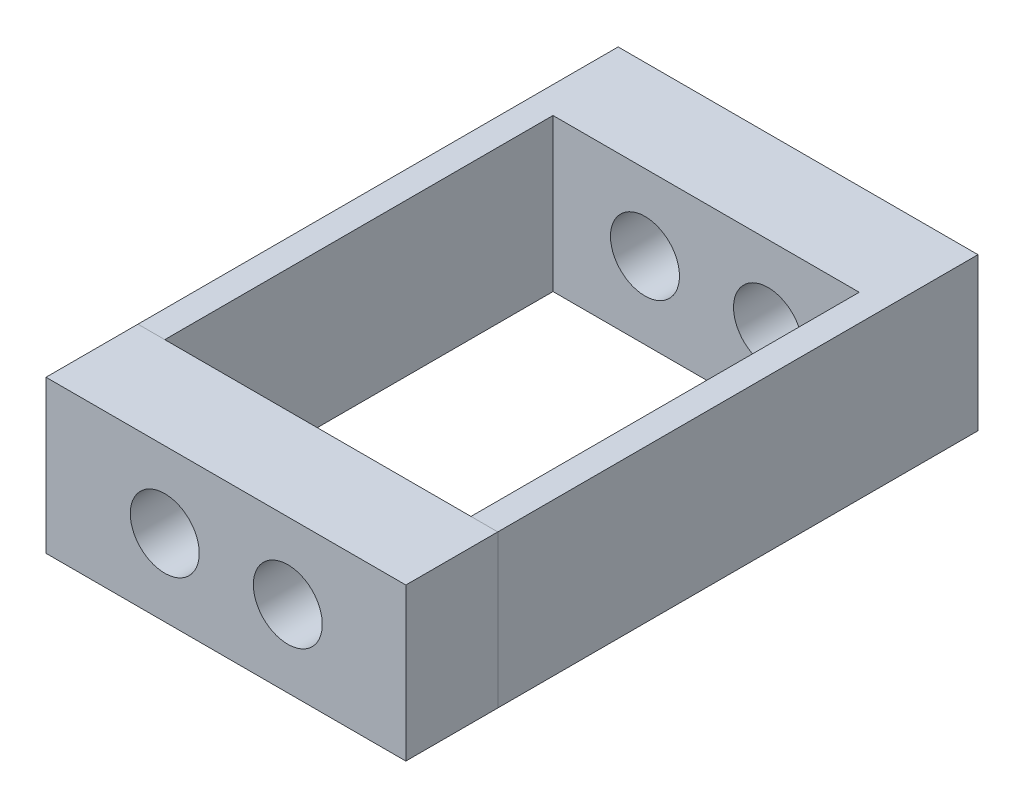
ISO-10303-21;
HEADER;
FILE_DESCRIPTION(('STEP AP214'),'2;1');
FILE_NAME('part.step','',(''),(''),'','','');
FILE_SCHEMA(('AUTOMOTIVE_DESIGN { 1 0 10303 214 1 1 1 1 }'));
ENDSEC;
DATA;
#1=APPLICATION_CONTEXT('core data for automotive mechanical design processes');
#2=APPLICATION_PROTOCOL_DEFINITION('international standard','automotive_design',2000,#1);
#3=PRODUCT_CONTEXT('',#1,'mechanical');
#4=PRODUCT('Part','Part','',(#3));
#5=PRODUCT_RELATED_PRODUCT_CATEGORY('part','',(#4));
#6=PRODUCT_DEFINITION_FORMATION('','',#4);
#7=PRODUCT_DEFINITION_CONTEXT('part definition',#1,'design');
#8=PRODUCT_DEFINITION('design','',#6,#7);
#9=PRODUCT_DEFINITION_SHAPE('','',#8);
#10=(LENGTH_UNIT() NAMED_UNIT(*) SI_UNIT(.MILLI.,.METRE.));
#11=(NAMED_UNIT(*) PLANE_ANGLE_UNIT() SI_UNIT($,.RADIAN.));
#12=(NAMED_UNIT(*) SI_UNIT($,.STERADIAN.) SOLID_ANGLE_UNIT());
#13=UNCERTAINTY_MEASURE_WITH_UNIT(LENGTH_MEASURE(1.E-05),#10,'distance_accuracy_value','');
#14=(GEOMETRIC_REPRESENTATION_CONTEXT(3) GLOBAL_UNCERTAINTY_ASSIGNED_CONTEXT((#13)) GLOBAL_UNIT_ASSIGNED_CONTEXT((#10,
#11,#12)) REPRESENTATION_CONTEXT('',''));
#15=CARTESIAN_POINT('',(0.,0.,0.));
#16=DIRECTION('',(0.,0.,1.));
#17=DIRECTION('',(1.,0.,0.));
#18=AXIS2_PLACEMENT_3D('',#15,#16,#17);
#19=CARTESIAN_POINT('',(0.,0.,259.765800000025));
#20=DIRECTION('',(0.,0.,-1.));
#21=DIRECTION('',(-1.,0.,0.));
#22=AXIS2_PLACEMENT_3D('',#19,#20,#21);
#23=PLANE('',#22);
#24=DIRECTION('',(0.,1.,0.));
#25=VECTOR('',#24,1.);
#26=CARTESIAN_POINT('',(99.8991867373547,311.52283430118,259.765800000025));
#27=LINE('',#26,#25);
#28=CARTESIAN_POINT('',(99.8991867373547,-31.75,259.765800000025));
#29=VERTEX_POINT('',#28);
#30=CARTESIAN_POINT('',(99.8991867373547,31.4461867373069,259.765800000025));
#31=VERTEX_POINT('',#30);
#32=EDGE_CURVE('E128',#29,#31,#27,.T.);
#33=ORIENTED_EDGE('',*,*,#32,.F.);
#34=DIRECTION('',(1.,0.,0.));
#35=VECTOR('',#34,1.);
#36=CARTESIAN_POINT('',(-399999.0602,-31.75,259.765800000025));
#37=LINE('',#36,#35);
#38=CARTESIAN_POINT('',(-49.2124999999874,-31.75,259.765800000025));
#39=VERTEX_POINT('',#38);
#40=EDGE_CURVE('E119',#39,#29,#37,.T.);
#41=ORIENTED_EDGE('',*,*,#40,.F.);
#42=DIRECTION('',(0.,1.,0.));
#43=VECTOR('',#42,1.);
#44=CARTESIAN_POINT('',(-49.2124999999874,311.52283430118,259.765800000025));
#45=LINE('',#44,#43);
#46=CARTESIAN_POINT('',(-49.2124999999874,31.4461867373069,259.765800000025));
#47=VERTEX_POINT('',#46);
#48=EDGE_CURVE('E136',#39,#47,#45,.T.);
#49=ORIENTED_EDGE('',*,*,#48,.T.);
#50=DIRECTION('',(1.,0.,0.));
#51=VECTOR('',#50,1.);
#52=CARTESIAN_POINT('',(-399999.0602,31.4461867373069,259.765800000025));
#53=LINE('',#52,#51);
#54=EDGE_CURVE('E134',#47,#31,#53,.T.);
#55=ORIENTED_EDGE('',*,*,#54,.T.);
#56=EDGE_LOOP('',(#33,#41,#49,#55));
#57=FACE_BOUND('',#56,.T.);
#58=CARTESIAN_POINT('',(0.,0.,259.765800000025));
#59=DIRECTION('',(0.,0.,-1.));
#60=DIRECTION('',(-1.,0.,0.));
#61=AXIS2_PLACEMENT_3D('',#58,#59,#60);
#62=CIRCLE('',#61,14.2875);
#63=CARTESIAN_POINT('',(-14.2875,0.,259.765800000025));
#64=VERTEX_POINT('',#63);
#65=EDGE_CURVE('E155',#64,#64,#62,.T.);
#66=ORIENTED_EDGE('',*,*,#65,.F.);
#67=EDGE_LOOP('',(#66));
#68=FACE_BOUND('',#67,.T.);
#69=CARTESIAN_POINT('',(50.9905,0.,259.765800000025));
#70=DIRECTION('',(0.,0.,-1.));
#71=DIRECTION('',(-1.,0.,0.));
#72=AXIS2_PLACEMENT_3D('',#69,#70,#71);
#73=CIRCLE('',#72,14.2875);
#74=CARTESIAN_POINT('',(36.703,0.,259.765800000025));
#75=VERTEX_POINT('',#74);
#76=EDGE_CURVE('E14',#75,#75,#73,.T.);
#77=ORIENTED_EDGE('',*,*,#76,.F.);
#78=EDGE_LOOP('',(#77));
#79=FACE_BOUND('',#78,.T.);
#80=ADVANCED_FACE('F76',(#57,#68,#79),#23,.T.);
#81=CARTESIAN_POINT('',(-399999.0602,311.52283430118,297.865800000011));
#82=DIRECTION('',(0.,0.,-1.));
#83=DIRECTION('',(-1.,0.,0.));
#84=AXIS2_PLACEMENT_3D('',#81,#82,#83);
#85=PLANE('',#84);
#86=CARTESIAN_POINT('',(0.,0.,297.865800000011));
#87=DIRECTION('',(0.,0.,-1.));
#88=DIRECTION('',(-1.,0.,0.));
#89=AXIS2_PLACEMENT_3D('',#86,#87,#88);
#90=CIRCLE('',#89,14.2875);
#91=CARTESIAN_POINT('',(-14.2875,0.,297.865800000011));
#92=VERTEX_POINT('',#91);
#93=EDGE_CURVE('E151',#92,#92,#90,.T.);
#94=ORIENTED_EDGE('',*,*,#93,.T.);
#95=EDGE_LOOP('',(#94));
#96=FACE_BOUND('',#95,.T.);
#97=CARTESIAN_POINT('',(50.9905,0.,297.865800000011));
#98=DIRECTION('',(0.,0.,-1.));
#99=DIRECTION('',(-1.,0.,0.));
#100=AXIS2_PLACEMENT_3D('',#97,#98,#99);
#101=CIRCLE('',#100,14.2875);
#102=CARTESIAN_POINT('',(36.703,0.,297.865800000011));
#103=VERTEX_POINT('',#102);
#104=EDGE_CURVE('E85',#103,#103,#101,.T.);
#105=ORIENTED_EDGE('',*,*,#104,.T.);
#106=EDGE_LOOP('',(#105));
#107=FACE_BOUND('',#106,.T.);
#108=DIRECTION('',(1.,0.,0.));
#109=VECTOR('',#108,1.);
#110=CARTESIAN_POINT('',(-399999.0602,31.4461867373069,297.865800000011));
#111=LINE('',#110,#109);
#112=CARTESIAN_POINT('',(-49.2125000000101,31.4461867373069,297.865800000011));
#113=VERTEX_POINT('',#112);
#114=CARTESIAN_POINT('',(99.899186737332,31.4461867373069,297.865800000011));
#115=VERTEX_POINT('',#114);
#116=EDGE_CURVE('E144',#113,#115,#111,.T.);
#117=ORIENTED_EDGE('',*,*,#116,.F.);
#118=DIRECTION('',(0.,-1.,0.));
#119=VECTOR('',#118,1.);
#120=CARTESIAN_POINT('',(-49.2125000000101,311.52283430118,297.865800000011));
#121=LINE('',#120,#119);
#122=CARTESIAN_POINT('',(-49.2125000000101,-31.75,297.865800000011));
#123=VERTEX_POINT('',#122);
#124=EDGE_CURVE('E135',#113,#123,#121,.T.);
#125=ORIENTED_EDGE('',*,*,#124,.T.);
#126=DIRECTION('',(1.,0.,0.));
#127=VECTOR('',#126,1.);
#128=CARTESIAN_POINT('',(-399999.0602,-31.75,297.865800000011));
#129=LINE('',#128,#127);
#130=CARTESIAN_POINT('',(99.899186737332,-31.75,297.865800000011));
#131=VERTEX_POINT('',#130);
#132=EDGE_CURVE('E131',#123,#131,#129,.T.);
#133=ORIENTED_EDGE('',*,*,#132,.T.);
#134=DIRECTION('',(0.,-1.,0.));
#135=VECTOR('',#134,1.);
#136=CARTESIAN_POINT('',(99.899186737332,311.52283430118,297.865800000011));
#137=LINE('',#136,#135);
#138=EDGE_CURVE('E129',#115,#131,#137,.T.);
#139=ORIENTED_EDGE('',*,*,#138,.F.);
#140=EDGE_LOOP('',(#117,#125,#133,#139));
#141=FACE_BOUND('',#140,.T.);
#142=ADVANCED_FACE('F165',(#96,#107,#141),#85,.F.);
#143=CARTESIAN_POINT('',(0.,0.,60.7822000000056));
#144=DIRECTION('',(0.,0.,1.));
#145=DIRECTION('',(1.,0.,0.));
#146=AXIS2_PLACEMENT_3D('',#143,#144,#145);
#147=CYLINDRICAL_SURFACE('',#146,14.2875);
#148=ORIENTED_EDGE('',*,*,#65,.T.);
#149=EDGE_LOOP('',(#148));
#150=FACE_BOUND('',#149,.T.);
#151=ORIENTED_EDGE('',*,*,#93,.F.);
#152=EDGE_LOOP('',(#151));
#153=FACE_BOUND('',#152,.T.);
#154=ADVANCED_FACE('F78',(#150,#153),#147,.F.);
#155=CARTESIAN_POINT('',(50.9905,0.,60.7822000000056));
#156=DIRECTION('',(0.,0.,1.));
#157=DIRECTION('',(1.,0.,0.));
#158=AXIS2_PLACEMENT_3D('',#155,#156,#157);
#159=CYLINDRICAL_SURFACE('',#158,14.2875);
#160=ORIENTED_EDGE('',*,*,#76,.T.);
#161=EDGE_LOOP('',(#160));
#162=FACE_BOUND('',#161,.T.);
#163=ORIENTED_EDGE('',*,*,#104,.F.);
#164=EDGE_LOOP('',(#163));
#165=FACE_BOUND('',#164,.T.);
#166=ADVANCED_FACE('F169',(#162,#165),#159,.F.);
#167=CARTESIAN_POINT('',(-49.2124999999533,311.52283430118,291851.44222));
#168=DIRECTION('',(1.,0.,0.));
#169=DIRECTION('',(0.,0.,-1.));
#170=AXIS2_PLACEMENT_3D('',#167,#168,#169);
#171=PLANE('',#170);
#172=ORIENTED_EDGE('',*,*,#48,.F.);
#173=DIRECTION('',(0.,0.,1.));
#174=VECTOR('',#173,1.);
#175=CARTESIAN_POINT('',(-49.2124999999533,-31.75,291851.44222));
#176=LINE('',#175,#174);
#177=EDGE_CURVE('E121',#39,#123,#176,.T.);
#178=ORIENTED_EDGE('',*,*,#177,.T.);
#179=ORIENTED_EDGE('',*,*,#124,.F.);
#180=DIRECTION('',(0.,0.,1.));
#181=VECTOR('',#180,1.);
#182=CARTESIAN_POINT('',(-49.2124999999533,31.4461867373069,291851.44222));
#183=LINE('',#182,#181);
#184=EDGE_CURVE('E80',#47,#113,#183,.T.);
#185=ORIENTED_EDGE('',*,*,#184,.F.);
#186=EDGE_LOOP('',(#172,#178,#179,#185));
#187=FACE_BOUND('',#186,.T.);
#188=ADVANCED_FACE('F167',(#187),#171,.F.);
#189=CARTESIAN_POINT('',(99.8991867373888,311.52283430118,291851.44222));
#190=DIRECTION('',(1.,0.,0.));
#191=DIRECTION('',(0.,0.,-1.));
#192=AXIS2_PLACEMENT_3D('',#189,#190,#191);
#193=PLANE('',#192);
#194=DIRECTION('',(0.,0.,1.));
#195=VECTOR('',#194,1.);
#196=CARTESIAN_POINT('',(99.8991867373888,-31.75,291851.44222));
#197=LINE('',#196,#195);
#198=EDGE_CURVE('E101',#29,#131,#197,.T.);
#199=ORIENTED_EDGE('',*,*,#198,.F.);
#200=ORIENTED_EDGE('',*,*,#32,.T.);
#201=DIRECTION('',(0.,0.,1.));
#202=VECTOR('',#201,1.);
#203=CARTESIAN_POINT('',(99.8991867373888,31.4461867373069,291851.44222));
#204=LINE('',#203,#202);
#205=EDGE_CURVE('E93',#31,#115,#204,.T.);
#206=ORIENTED_EDGE('',*,*,#205,.T.);
#207=ORIENTED_EDGE('',*,*,#138,.T.);
#208=EDGE_LOOP('',(#199,#200,#206,#207));
#209=FACE_BOUND('',#208,.T.);
#210=ADVANCED_FACE('F127',(#209),#193,.T.);
#211=CARTESIAN_POINT('',(0.,31.4461867373068,0.));
#212=DIRECTION('',(0.,1.,0.));
#213=DIRECTION('',(0.,0.,1.));
#214=AXIS2_PLACEMENT_3D('',#211,#212,#213);
#215=PLANE('',#214);
#216=ORIENTED_EDGE('',*,*,#205,.F.);
#217=ORIENTED_EDGE('',*,*,#54,.F.);
#218=ORIENTED_EDGE('',*,*,#184,.T.);
#219=ORIENTED_EDGE('',*,*,#116,.T.);
#220=EDGE_LOOP('',(#216,#217,#218,#219));
#221=FACE_BOUND('',#220,.T.);
#222=ADVANCED_FACE('F174',(#221),#215,.T.);
#223=CARTESIAN_POINT('',(0.,-31.75,0.));
#224=DIRECTION('',(0.,1.,0.));
#225=DIRECTION('',(0.,0.,1.));
#226=AXIS2_PLACEMENT_3D('',#223,#224,#225);
#227=PLANE('',#226);
#228=ORIENTED_EDGE('',*,*,#40,.T.);
#229=ORIENTED_EDGE('',*,*,#198,.T.);
#230=ORIENTED_EDGE('',*,*,#132,.F.);
#231=ORIENTED_EDGE('',*,*,#177,.F.);
#232=EDGE_LOOP('',(#228,#229,#230,#231));
#233=FACE_BOUND('',#232,.T.);
#234=ADVANCED_FACE('F120',(#233),#227,.F.);
#235=CLOSED_SHELL('',(#80,#142,#154,#166,#188,#210,#222,#234));
#236=MANIFOLD_SOLID_BREP('B2',#235);
#237=CARTESIAN_POINT('',(0.,0.,259.765800000025));
#238=DIRECTION('',(0.,0.,-1.));
#239=DIRECTION('',(-1.,0.,0.));
#240=AXIS2_PLACEMENT_3D('',#237,#238,#239);
#241=PLANE('',#240);
#242=DIRECTION('',(0.,-1.,0.));
#243=VECTOR('',#242,1.);
#244=CARTESIAN_POINT('',(88.7866867373143,311.52283430118,259.765800000025));
#245=LINE('',#244,#243);
#246=CARTESIAN_POINT('',(88.7866867373143,31.4461867373069,259.765800000025));
#247=VERTEX_POINT('',#246);
#248=CARTESIAN_POINT('',(88.7866867373143,-31.75,259.765800000025));
#249=VERTEX_POINT('',#248);
#250=EDGE_CURVE('E74',#247,#249,#245,.T.);
#251=ORIENTED_EDGE('',*,*,#250,.T.);
#252=DIRECTION('',(-1.,0.,0.));
#253=VECTOR('',#252,1.);
#254=CARTESIAN_POINT('',(0.,-31.75,259.765800000025));
#255=LINE('',#254,#253);
#256=CARTESIAN_POINT('',(99.8991867373547,-31.75,259.765800000025));
#257=VERTEX_POINT('',#256);
#258=EDGE_CURVE('E252',#257,#249,#255,.T.);
#259=ORIENTED_EDGE('',*,*,#258,.F.);
#260=DIRECTION('',(0.,1.,0.));
#261=VECTOR('',#260,1.);
#262=CARTESIAN_POINT('',(99.8991867373547,311.52283430118,259.765800000025));
#263=LINE('',#262,#261);
#264=CARTESIAN_POINT('',(99.8991867373547,31.4461867373069,259.765800000025));
#265=VERTEX_POINT('',#264);
#266=EDGE_CURVE('E360',#257,#265,#263,.T.);
#267=ORIENTED_EDGE('',*,*,#266,.T.);
#268=DIRECTION('',(-1.,0.,0.));
#269=VECTOR('',#268,1.);
#270=CARTESIAN_POINT('',(0.,31.4461867373068,259.765800000025));
#271=LINE('',#270,#269);
#272=EDGE_CURVE('E264',#265,#247,#271,.T.);
#273=ORIENTED_EDGE('',*,*,#272,.T.);
#274=EDGE_LOOP('',(#251,#259,#267,#273));
#275=FACE_BOUND('',#274,.T.);
#276=ADVANCED_FACE('F248',(#275),#241,.F.);
#277=CARTESIAN_POINT('',(-38.0999999999667,31.4461867373069,259.765800000025));
#278=VERTEX_POINT('',#277);
#279=CARTESIAN_POINT('',(-49.2124999999874,31.4461867373069,259.765800000025));
#280=VERTEX_POINT('',#279);
#281=EDGE_CURVE('E257',#278,#280,#271,.T.);
#282=ORIENTED_EDGE('',*,*,#281,.T.);
#283=DIRECTION('',(0.,1.,0.));
#284=VECTOR('',#283,1.);
#285=CARTESIAN_POINT('',(-49.2124999999874,311.52283430118,259.765800000025));
#286=LINE('',#285,#284);
#287=CARTESIAN_POINT('',(-49.2124999999874,-31.75,259.765800000025));
#288=VERTEX_POINT('',#287);
#289=EDGE_CURVE('E361',#288,#280,#286,.T.);
#290=ORIENTED_EDGE('',*,*,#289,.F.);
#291=CARTESIAN_POINT('',(-38.0999999999667,-31.75,259.765800000025));
#292=VERTEX_POINT('',#291);
#293=EDGE_CURVE('E325',#292,#288,#255,.T.);
#294=ORIENTED_EDGE('',*,*,#293,.F.);
#295=DIRECTION('',(0.,-1.,0.));
#296=VECTOR('',#295,1.);
#297=CARTESIAN_POINT('',(-38.0999999999667,311.52283430118,259.765800000025));
#298=LINE('',#297,#296);
#299=EDGE_CURVE('E342',#278,#292,#298,.T.);
#300=ORIENTED_EDGE('',*,*,#299,.F.);
#301=EDGE_LOOP('',(#282,#290,#294,#300));
#302=FACE_BOUND('',#301,.T.);
#303=ADVANCED_FACE('F250',(#302),#241,.F.);
#304=CARTESIAN_POINT('',(-49.2124999999533,311.52283430118,291851.44222));
#305=DIRECTION('',(1.,0.,0.));
#306=DIRECTION('',(0.,0.,-1.));
#307=AXIS2_PLACEMENT_3D('',#304,#305,#306);
#308=PLANE('',#307);
#309=DIRECTION('',(0.,0.,1.));
#310=VECTOR('',#309,1.);
#311=CARTESIAN_POINT('',(-49.2124999999533,-31.75,291851.44222));
#312=LINE('',#311,#310);
#313=CARTESIAN_POINT('',(-49.2124999999874,-31.75,60.7822000000056));
#314=VERTEX_POINT('',#313);
#315=EDGE_CURVE('E350',#314,#288,#312,.T.);
#316=ORIENTED_EDGE('',*,*,#315,.T.);
#317=ORIENTED_EDGE('',*,*,#289,.T.);
#318=DIRECTION('',(0.,0.,1.));
#319=VECTOR('',#318,1.);
#320=CARTESIAN_POINT('',(-49.2124999999533,31.4461867373069,291851.44222));
#321=LINE('',#320,#319);
#322=CARTESIAN_POINT('',(-49.2124999999874,31.4461867373069,60.7822000000056));
#323=VERTEX_POINT('',#322);
#324=EDGE_CURVE('E371',#323,#280,#321,.T.);
#325=ORIENTED_EDGE('',*,*,#324,.F.);
#326=DIRECTION('',(0.,-1.,0.));
#327=VECTOR('',#326,1.);
#328=CARTESIAN_POINT('',(-49.2124999999874,311.52283430118,60.7822000000056));
#329=LINE('',#328,#327);
#330=EDGE_CURVE('E356',#323,#314,#329,.T.);
#331=ORIENTED_EDGE('',*,*,#330,.T.);
#332=EDGE_LOOP('',(#316,#317,#325,#331));
#333=FACE_BOUND('',#332,.T.);
#334=ADVANCED_FACE('F369',(#333),#308,.F.);
#335=CARTESIAN_POINT('',(-399999.0602,311.52283430118,60.7822000000056));
#336=DIRECTION('',(0.,0.,-1.));
#337=DIRECTION('',(-1.,0.,0.));
#338=AXIS2_PLACEMENT_3D('',#335,#336,#337);
#339=PLANE('',#338);
#340=CARTESIAN_POINT('',(0.,0.,60.7822000000056));
#341=DIRECTION('',(0.,0.,1.));
#342=DIRECTION('',(1.,0.,0.));
#343=AXIS2_PLACEMENT_3D('',#340,#341,#342);
#344=CIRCLE('',#343,14.2875);
#345=CARTESIAN_POINT('',(14.2875,0.,60.7822000000056));
#346=VERTEX_POINT('',#345);
#347=EDGE_CURVE('E397',#346,#346,#344,.T.);
#348=ORIENTED_EDGE('',*,*,#347,.T.);
#349=EDGE_LOOP('',(#348));
#350=FACE_BOUND('',#349,.T.);
#351=CARTESIAN_POINT('',(50.9905,0.,60.7822000000056));
#352=DIRECTION('',(0.,0.,1.));
#353=DIRECTION('',(1.,0.,0.));
#354=AXIS2_PLACEMENT_3D('',#351,#352,#353);
#355=CIRCLE('',#354,14.2875);
#356=CARTESIAN_POINT('',(65.278,0.,60.7822000000056));
#357=VERTEX_POINT('',#356);
#358=EDGE_CURVE('E398',#357,#357,#355,.T.);
#359=ORIENTED_EDGE('',*,*,#358,.T.);
#360=EDGE_LOOP('',(#359));
#361=FACE_BOUND('',#360,.T.);
#362=ORIENTED_EDGE('',*,*,#330,.F.);
#363=DIRECTION('',(1.,0.,0.));
#364=VECTOR('',#363,1.);
#365=CARTESIAN_POINT('',(-399999.0602,31.4461867373069,60.7822000000056));
#366=LINE('',#365,#364);
#367=CARTESIAN_POINT('',(99.899186737332,31.4461867373069,60.7822000000056));
#368=VERTEX_POINT('',#367);
#369=EDGE_CURVE('E375',#323,#368,#366,.T.);
#370=ORIENTED_EDGE('',*,*,#369,.T.);
#371=DIRECTION('',(0.,-1.,0.));
#372=VECTOR('',#371,1.);
#373=CARTESIAN_POINT('',(99.899186737332,311.52283430118,60.7822000000056));
#374=LINE('',#373,#372);
#375=CARTESIAN_POINT('',(99.899186737332,-31.75,60.7822000000056));
#376=VERTEX_POINT('',#375);
#377=EDGE_CURVE('E326',#368,#376,#374,.T.);
#378=ORIENTED_EDGE('',*,*,#377,.T.);
#379=DIRECTION('',(1.,0.,0.));
#380=VECTOR('',#379,1.);
#381=CARTESIAN_POINT('',(-399999.0602,-31.75,60.7822000000056));
#382=LINE('',#381,#380);
#383=EDGE_CURVE('E353',#314,#376,#382,.T.);
#384=ORIENTED_EDGE('',*,*,#383,.F.);
#385=EDGE_LOOP('',(#362,#370,#378,#384));
#386=FACE_BOUND('',#385,.T.);
#387=ADVANCED_FACE('F374',(#350,#361,#386),#339,.T.);
#388=CARTESIAN_POINT('',(99.8991867373888,311.52283430118,291851.44222));
#389=DIRECTION('',(1.,0.,0.));
#390=DIRECTION('',(0.,0.,-1.));
#391=AXIS2_PLACEMENT_3D('',#388,#389,#390);
#392=PLANE('',#391);
#393=ORIENTED_EDGE('',*,*,#266,.F.);
#394=DIRECTION('',(0.,0.,1.));
#395=VECTOR('',#394,1.);
#396=CARTESIAN_POINT('',(99.8991867373888,-31.75,291851.44222));
#397=LINE('',#396,#395);
#398=EDGE_CURVE('E344',#376,#257,#397,.T.);
#399=ORIENTED_EDGE('',*,*,#398,.F.);
#400=ORIENTED_EDGE('',*,*,#377,.F.);
#401=DIRECTION('',(0.,0.,1.));
#402=VECTOR('',#401,1.);
#403=CARTESIAN_POINT('',(99.8991867373888,31.4461867373069,291851.44222));
#404=LINE('',#403,#402);
#405=EDGE_CURVE('E379',#368,#265,#404,.T.);
#406=ORIENTED_EDGE('',*,*,#405,.T.);
#407=EDGE_LOOP('',(#393,#399,#400,#406));
#408=FACE_BOUND('',#407,.T.);
#409=ADVANCED_FACE('F433',(#408),#392,.T.);
#410=CARTESIAN_POINT('',(0.,-31.75,0.));
#411=DIRECTION('',(0.,1.,0.));
#412=DIRECTION('',(0.,0.,1.));
#413=AXIS2_PLACEMENT_3D('',#410,#411,#412);
#414=PLANE('',#413);
#415=ORIENTED_EDGE('',*,*,#398,.T.);
#416=ORIENTED_EDGE('',*,*,#258,.T.);
#417=DIRECTION('',(0.,0.,1.));
#418=VECTOR('',#417,1.);
#419=CARTESIAN_POINT('',(88.7866867373646,-31.75,291851.44222));
#420=LINE('',#419,#418);
#421=CARTESIAN_POINT('',(88.7866867373077,-31.75,98.8821999999914));
#422=VERTEX_POINT('',#421);
#423=EDGE_CURVE('E381',#422,#249,#420,.T.);
#424=ORIENTED_EDGE('',*,*,#423,.F.);
#425=DIRECTION('',(1.,0.,0.));
#426=VECTOR('',#425,1.);
#427=CARTESIAN_POINT('',(-399999.0602,-31.75,98.8821999999914));
#428=LINE('',#427,#426);
#429=CARTESIAN_POINT('',(-38.0999999999667,-31.75,98.8821999999914));
#430=VERTEX_POINT('',#429);
#431=EDGE_CURVE('E388',#430,#422,#428,.T.);
#432=ORIENTED_EDGE('',*,*,#431,.F.);
#433=DIRECTION('',(0.,0.,1.));
#434=VECTOR('',#433,1.);
#435=CARTESIAN_POINT('',(-38.099999999929,-31.75,291851.44222));
#436=LINE('',#435,#434);
#437=EDGE_CURVE('E340',#430,#292,#436,.T.);
#438=ORIENTED_EDGE('',*,*,#437,.T.);
#439=ORIENTED_EDGE('',*,*,#293,.T.);
#440=ORIENTED_EDGE('',*,*,#315,.F.);
#441=ORIENTED_EDGE('',*,*,#383,.T.);
#442=EDGE_LOOP('',(#415,#416,#424,#432,#438,#439,#440,#441));
#443=FACE_BOUND('',#442,.T.);
#444=ADVANCED_FACE('F366',(#443),#414,.F.);
#445=CARTESIAN_POINT('',(-38.099999999929,311.52283430118,291851.44222));
#446=DIRECTION('',(1.,0.,0.));
#447=DIRECTION('',(0.,0.,-1.));
#448=AXIS2_PLACEMENT_3D('',#445,#446,#447);
#449=PLANE('',#448);
#450=DIRECTION('',(0.,-1.,0.));
#451=VECTOR('',#450,1.);
#452=CARTESIAN_POINT('',(-38.0999999999667,311.52283430118,98.8821999999914));
#453=LINE('',#452,#451);
#454=CARTESIAN_POINT('',(-38.0999999999667,31.4461867373069,98.8821999999914));
#455=VERTEX_POINT('',#454);
#456=EDGE_CURVE('E331',#455,#430,#453,.T.);
#457=ORIENTED_EDGE('',*,*,#456,.F.);
#458=DIRECTION('',(0.,0.,1.));
#459=VECTOR('',#458,1.);
#460=CARTESIAN_POINT('',(-38.099999999929,31.4461867373069,291851.44222));
#461=LINE('',#460,#459);
#462=EDGE_CURVE('E315',#455,#278,#461,.T.);
#463=ORIENTED_EDGE('',*,*,#462,.T.);
#464=ORIENTED_EDGE('',*,*,#299,.T.);
#465=ORIENTED_EDGE('',*,*,#437,.F.);
#466=EDGE_LOOP('',(#457,#463,#464,#465));
#467=FACE_BOUND('',#466,.T.);
#468=ADVANCED_FACE('F338',(#467),#449,.T.);
#469=CARTESIAN_POINT('',(-399999.0602,311.52283430118,98.8821999999914));
#470=DIRECTION('',(0.,0.,-1.));
#471=DIRECTION('',(-1.,0.,0.));
#472=AXIS2_PLACEMENT_3D('',#469,#470,#471);
#473=PLANE('',#472);
#474=CARTESIAN_POINT('',(0.,0.,98.8821999999914));
#475=DIRECTION('',(0.,0.,-1.));
#476=DIRECTION('',(-1.,0.,0.));
#477=AXIS2_PLACEMENT_3D('',#474,#475,#476);
#478=CIRCLE('',#477,14.2875);
#479=CARTESIAN_POINT('',(-14.2875,0.,98.8821999999914));
#480=VERTEX_POINT('',#479);
#481=EDGE_CURVE('E336',#480,#480,#478,.T.);
#482=ORIENTED_EDGE('',*,*,#481,.T.);
#483=EDGE_LOOP('',(#482));
#484=FACE_BOUND('',#483,.T.);
#485=CARTESIAN_POINT('',(50.9905,0.,98.8821999999914));
#486=DIRECTION('',(0.,0.,-1.));
#487=DIRECTION('',(-1.,0.,0.));
#488=AXIS2_PLACEMENT_3D('',#485,#486,#487);
#489=CIRCLE('',#488,14.2875);
#490=CARTESIAN_POINT('',(36.703,0.,98.8821999999914));
#491=VERTEX_POINT('',#490);
#492=EDGE_CURVE('E394',#491,#491,#489,.T.);
#493=ORIENTED_EDGE('',*,*,#492,.T.);
#494=EDGE_LOOP('',(#493));
#495=FACE_BOUND('',#494,.T.);
#496=DIRECTION('',(1.,0.,0.));
#497=VECTOR('',#496,1.);
#498=CARTESIAN_POINT('',(-399999.0602,31.4461867373069,98.8821999999914));
#499=LINE('',#498,#497);
#500=CARTESIAN_POINT('',(88.7866867373077,31.4461867373069,98.8821999999914));
#501=VERTEX_POINT('',#500);
#502=EDGE_CURVE('E319',#455,#501,#499,.T.);
#503=ORIENTED_EDGE('',*,*,#502,.F.);
#504=ORIENTED_EDGE('',*,*,#456,.T.);
#505=ORIENTED_EDGE('',*,*,#431,.T.);
#506=DIRECTION('',(0.,-1.,0.));
#507=VECTOR('',#506,1.);
#508=CARTESIAN_POINT('',(88.7866867373077,311.52283430118,98.8821999999914));
#509=LINE('',#508,#507);
#510=EDGE_CURVE('E333',#501,#422,#509,.T.);
#511=ORIENTED_EDGE('',*,*,#510,.F.);
#512=EDGE_LOOP('',(#503,#504,#505,#511));
#513=FACE_BOUND('',#512,.T.);
#514=ADVANCED_FACE('F329',(#484,#495,#513),#473,.F.);
#515=CARTESIAN_POINT('',(88.7866867373646,311.52283430118,291851.44222));
#516=DIRECTION('',(1.,0.,0.));
#517=DIRECTION('',(0.,0.,-1.));
#518=AXIS2_PLACEMENT_3D('',#515,#516,#517);
#519=PLANE('',#518);
#520=DIRECTION('',(0.,0.,1.));
#521=VECTOR('',#520,1.);
#522=CARTESIAN_POINT('',(88.7866867373646,31.4461867373069,291851.44222));
#523=LINE('',#522,#521);
#524=EDGE_CURVE('E335',#501,#247,#523,.T.);
#525=ORIENTED_EDGE('',*,*,#524,.F.);
#526=ORIENTED_EDGE('',*,*,#510,.T.);
#527=ORIENTED_EDGE('',*,*,#423,.T.);
#528=ORIENTED_EDGE('',*,*,#250,.F.);
#529=EDGE_LOOP('',(#525,#526,#527,#528));
#530=FACE_BOUND('',#529,.T.);
#531=ADVANCED_FACE('F390',(#530),#519,.F.);
#532=CARTESIAN_POINT('',(0.,31.4461867373068,0.));
#533=DIRECTION('',(0.,1.,0.));
#534=DIRECTION('',(0.,0.,1.));
#535=AXIS2_PLACEMENT_3D('',#532,#533,#534);
#536=PLANE('',#535);
#537=ORIENTED_EDGE('',*,*,#272,.F.);
#538=ORIENTED_EDGE('',*,*,#405,.F.);
#539=ORIENTED_EDGE('',*,*,#369,.F.);
#540=ORIENTED_EDGE('',*,*,#324,.T.);
#541=ORIENTED_EDGE('',*,*,#281,.F.);
#542=ORIENTED_EDGE('',*,*,#462,.F.);
#543=ORIENTED_EDGE('',*,*,#502,.T.);
#544=ORIENTED_EDGE('',*,*,#524,.T.);
#545=EDGE_LOOP('',(#537,#538,#539,#540,#541,#542,#543,#544));
#546=FACE_BOUND('',#545,.T.);
#547=ADVANCED_FACE('F317',(#546),#536,.T.);
#548=CARTESIAN_POINT('',(50.9905,0.,60.7822000000056));
#549=DIRECTION('',(0.,0.,1.));
#550=DIRECTION('',(1.,0.,0.));
#551=AXIS2_PLACEMENT_3D('',#548,#549,#550);
#552=CYLINDRICAL_SURFACE('',#551,14.2875);
#553=ORIENTED_EDGE('',*,*,#358,.F.);
#554=EDGE_LOOP('',(#553));
#555=FACE_BOUND('',#554,.T.);
#556=ORIENTED_EDGE('',*,*,#492,.F.);
#557=EDGE_LOOP('',(#556));
#558=FACE_BOUND('',#557,.T.);
#559=ADVANCED_FACE('F409',(#555,#558),#552,.F.);
#560=CARTESIAN_POINT('',(0.,0.,60.7822000000056));
#561=DIRECTION('',(0.,0.,1.));
#562=DIRECTION('',(1.,0.,0.));
#563=AXIS2_PLACEMENT_3D('',#560,#561,#562);
#564=CYLINDRICAL_SURFACE('',#563,14.2875);
#565=ORIENTED_EDGE('',*,*,#347,.F.);
#566=EDGE_LOOP('',(#565));
#567=FACE_BOUND('',#566,.T.);
#568=ORIENTED_EDGE('',*,*,#481,.F.);
#569=EDGE_LOOP('',(#568));
#570=FACE_BOUND('',#569,.T.);
#571=ADVANCED_FACE('F406',(#567,#570),#564,.F.);
#572=CLOSED_SHELL('',(#276,#303,#334,#387,#409,#444,#468,#514,#531,#547,#559,#571));
#573=MANIFOLD_SOLID_BREP('B8',#572);
#574=ADVANCED_BREP_SHAPE_REPRESENTATION('',(#18,#236,#573),#14);
#575=SHAPE_DEFINITION_REPRESENTATION(#9,#574);
ENDSEC;
END-ISO-10303-21;
